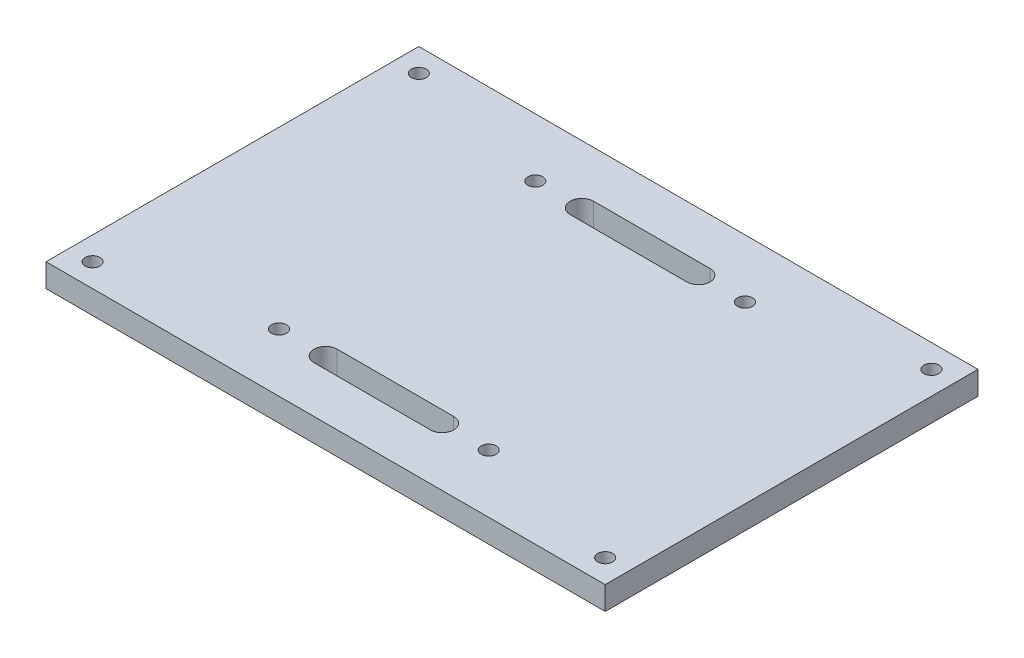
ISO-10303-21;
HEADER;
FILE_DESCRIPTION(('STEP AP214'),'2;1');
FILE_NAME('part.step','',(''),(''),'','','');
FILE_SCHEMA(('AUTOMOTIVE_DESIGN { 1 0 10303 214 1 1 1 1 }'));
ENDSEC;
DATA;
#1=APPLICATION_CONTEXT('core data for automotive mechanical design processes');
#2=APPLICATION_PROTOCOL_DEFINITION('international standard','automotive_design',2000,#1);
#3=PRODUCT_CONTEXT('',#1,'mechanical');
#4=PRODUCT('Part','Part','',(#3));
#5=PRODUCT_RELATED_PRODUCT_CATEGORY('part','',(#4));
#6=PRODUCT_DEFINITION_FORMATION('','',#4);
#7=PRODUCT_DEFINITION_CONTEXT('part definition',#1,'design');
#8=PRODUCT_DEFINITION('design','',#6,#7);
#9=PRODUCT_DEFINITION_SHAPE('','',#8);
#10=(LENGTH_UNIT() NAMED_UNIT(*) SI_UNIT(.MILLI.,.METRE.));
#11=(NAMED_UNIT(*) PLANE_ANGLE_UNIT() SI_UNIT($,.RADIAN.));
#12=(NAMED_UNIT(*) SI_UNIT($,.STERADIAN.) SOLID_ANGLE_UNIT());
#13=UNCERTAINTY_MEASURE_WITH_UNIT(LENGTH_MEASURE(1.E-05),#10,'distance_accuracy_value','');
#14=(GEOMETRIC_REPRESENTATION_CONTEXT(3) GLOBAL_UNCERTAINTY_ASSIGNED_CONTEXT((#13)) GLOBAL_UNIT_ASSIGNED_CONTEXT((#10,
#11,#12)) REPRESENTATION_CONTEXT('',''));
#15=CARTESIAN_POINT('',(0.,0.,0.));
#16=DIRECTION('',(0.,0.,1.));
#17=DIRECTION('',(1.,0.,0.));
#18=AXIS2_PLACEMENT_3D('',#15,#16,#17);
#19=CARTESIAN_POINT('',(0.,5.,0.));
#20=DIRECTION('',(1.,0.,0.));
#21=DIRECTION('',(0.,0.,-1.));
#22=AXIS2_PLACEMENT_3D('',#19,#20,#21);
#23=PLANE('',#22);
#24=DIRECTION('',(0.,0.,1.));
#25=VECTOR('',#24,1.);
#26=CARTESIAN_POINT('',(0.,0.,0.));
#27=LINE('',#26,#25);
#28=CARTESIAN_POINT('',(0.,0.,-80.));
#29=VERTEX_POINT('',#28);
#30=CARTESIAN_POINT('',(0.,0.,0.));
#31=VERTEX_POINT('',#30);
#32=EDGE_CURVE('E234',#29,#31,#27,.T.);
#33=ORIENTED_EDGE('',*,*,#32,.T.);
#34=DIRECTION('',(0.,-1.,0.));
#35=VECTOR('',#34,1.);
#36=CARTESIAN_POINT('',(0.,5.,0.));
#37=LINE('',#36,#35);
#38=CARTESIAN_POINT('',(0.,5.,0.));
#39=VERTEX_POINT('',#38);
#40=EDGE_CURVE('E11',#39,#31,#37,.T.);
#41=ORIENTED_EDGE('',*,*,#40,.F.);
#42=DIRECTION('',(0.,0.,1.));
#43=VECTOR('',#42,1.);
#44=CARTESIAN_POINT('',(0.,5.,0.));
#45=LINE('',#44,#43);
#46=CARTESIAN_POINT('',(0.,5.,-80.));
#47=VERTEX_POINT('',#46);
#48=EDGE_CURVE('E237',#47,#39,#45,.T.);
#49=ORIENTED_EDGE('',*,*,#48,.F.);
#50=DIRECTION('',(0.,-1.,0.));
#51=VECTOR('',#50,1.);
#52=CARTESIAN_POINT('',(0.,5.,-80.));
#53=LINE('',#52,#51);
#54=EDGE_CURVE('E247',#47,#29,#53,.T.);
#55=ORIENTED_EDGE('',*,*,#54,.T.);
#56=EDGE_LOOP('',(#33,#41,#49,#55));
#57=FACE_BOUND('',#56,.T.);
#58=ADVANCED_FACE('F33',(#57),#23,.F.);
#59=CARTESIAN_POINT('',(0.,5.,0.));
#60=DIRECTION('',(0.,0.,-1.));
#61=DIRECTION('',(-1.,0.,0.));
#62=AXIS2_PLACEMENT_3D('',#59,#60,#61);
#63=PLANE('',#62);
#64=DIRECTION('',(1.,0.,0.));
#65=VECTOR('',#64,1.);
#66=CARTESIAN_POINT('',(0.,0.,0.));
#67=LINE('',#66,#65);
#68=CARTESIAN_POINT('',(120.,0.,0.));
#69=VERTEX_POINT('',#68);
#70=EDGE_CURVE('E250',#31,#69,#67,.T.);
#71=ORIENTED_EDGE('',*,*,#70,.T.);
#72=DIRECTION('',(0.,-1.,0.));
#73=VECTOR('',#72,1.);
#74=CARTESIAN_POINT('',(120.,5.,0.));
#75=LINE('',#74,#73);
#76=CARTESIAN_POINT('',(120.,5.,0.));
#77=VERTEX_POINT('',#76);
#78=EDGE_CURVE('E40',#77,#69,#75,.T.);
#79=ORIENTED_EDGE('',*,*,#78,.F.);
#80=DIRECTION('',(1.,0.,0.));
#81=VECTOR('',#80,1.);
#82=CARTESIAN_POINT('',(0.,5.,0.));
#83=LINE('',#82,#81);
#84=EDGE_CURVE('E240',#39,#77,#83,.T.);
#85=ORIENTED_EDGE('',*,*,#84,.F.);
#86=ORIENTED_EDGE('',*,*,#40,.T.);
#87=EDGE_LOOP('',(#71,#79,#85,#86));
#88=FACE_BOUND('',#87,.T.);
#89=ADVANCED_FACE('F279',(#88),#63,.F.);
#90=CARTESIAN_POINT('',(120.,5.,0.));
#91=DIRECTION('',(-1.,0.,0.));
#92=DIRECTION('',(0.,0.,1.));
#93=AXIS2_PLACEMENT_3D('',#90,#91,#92);
#94=PLANE('',#93);
#95=DIRECTION('',(0.,0.,-1.));
#96=VECTOR('',#95,1.);
#97=CARTESIAN_POINT('',(120.,0.,0.));
#98=LINE('',#97,#96);
#99=CARTESIAN_POINT('',(120.,0.,-80.));
#100=VERTEX_POINT('',#99);
#101=EDGE_CURVE('E252',#69,#100,#98,.T.);
#102=ORIENTED_EDGE('',*,*,#101,.T.);
#103=DIRECTION('',(0.,-1.,0.));
#104=VECTOR('',#103,1.);
#105=CARTESIAN_POINT('',(120.,5.,-80.));
#106=LINE('',#105,#104);
#107=CARTESIAN_POINT('',(120.,5.,-80.));
#108=VERTEX_POINT('',#107);
#109=EDGE_CURVE('E257',#108,#100,#106,.T.);
#110=ORIENTED_EDGE('',*,*,#109,.F.);
#111=DIRECTION('',(0.,0.,-1.));
#112=VECTOR('',#111,1.);
#113=CARTESIAN_POINT('',(120.,5.,0.));
#114=LINE('',#113,#112);
#115=EDGE_CURVE('E243',#77,#108,#114,.T.);
#116=ORIENTED_EDGE('',*,*,#115,.F.);
#117=ORIENTED_EDGE('',*,*,#78,.T.);
#118=EDGE_LOOP('',(#102,#110,#116,#117));
#119=FACE_BOUND('',#118,.T.);
#120=ADVANCED_FACE('F264',(#119),#94,.F.);
#121=CARTESIAN_POINT('',(0.,5.,-80.));
#122=DIRECTION('',(0.,0.,1.));
#123=DIRECTION('',(1.,0.,0.));
#124=AXIS2_PLACEMENT_3D('',#121,#122,#123);
#125=PLANE('',#124);
#126=DIRECTION('',(-1.,0.,0.));
#127=VECTOR('',#126,1.);
#128=CARTESIAN_POINT('',(0.,0.,-80.));
#129=LINE('',#128,#127);
#130=EDGE_CURVE('E241',#100,#29,#129,.T.);
#131=ORIENTED_EDGE('',*,*,#130,.T.);
#132=ORIENTED_EDGE('',*,*,#54,.F.);
#133=DIRECTION('',(-1.,0.,0.));
#134=VECTOR('',#133,1.);
#135=CARTESIAN_POINT('',(0.,5.,-80.));
#136=LINE('',#135,#134);
#137=EDGE_CURVE('E245',#108,#47,#136,.T.);
#138=ORIENTED_EDGE('',*,*,#137,.F.);
#139=ORIENTED_EDGE('',*,*,#109,.T.);
#140=EDGE_LOOP('',(#131,#132,#138,#139));
#141=FACE_BOUND('',#140,.T.);
#142=ADVANCED_FACE('F272',(#141),#125,.F.);
#143=CARTESIAN_POINT('',(0.,5.,0.));
#144=DIRECTION('',(0.,-1.,0.));
#145=DIRECTION('',(0.,0.,-1.));
#146=AXIS2_PLACEMENT_3D('',#143,#144,#145);
#147=PLANE('',#146);
#148=CARTESIAN_POINT('',(115.,5.,-5.00000000000003));
#149=DIRECTION('',(0.,1.,0.));
#150=DIRECTION('',(0.,0.,1.));
#151=AXIS2_PLACEMENT_3D('',#148,#149,#150);
#152=CIRCLE('',#151,1.60000000000001);
#153=CARTESIAN_POINT('',(115.,5.,-3.40000000000003));
#154=VERTEX_POINT('',#153);
#155=EDGE_CURVE('E179',#154,#154,#152,.T.);
#156=ORIENTED_EDGE('',*,*,#155,.F.);
#157=EDGE_LOOP('',(#156));
#158=FACE_BOUND('',#157,.T.);
#159=CARTESIAN_POINT('',(115.,5.,-75.));
#160=DIRECTION('',(0.,1.,0.));
#161=DIRECTION('',(0.,0.,-1.));
#162=AXIS2_PLACEMENT_3D('',#159,#160,#161);
#163=CIRCLE('',#162,1.60000000000001);
#164=CARTESIAN_POINT('',(115.,5.,-76.6));
#165=VERTEX_POINT('',#164);
#166=EDGE_CURVE('E173',#165,#165,#163,.T.);
#167=ORIENTED_EDGE('',*,*,#166,.F.);
#168=EDGE_LOOP('',(#167));
#169=FACE_BOUND('',#168,.T.);
#170=CARTESIAN_POINT('',(5.,5.,-75.));
#171=DIRECTION('',(0.,1.,0.));
#172=DIRECTION('',(0.,0.,1.));
#173=AXIS2_PLACEMENT_3D('',#170,#171,#172);
#174=CIRCLE('',#173,1.6);
#175=CARTESIAN_POINT('',(5.,5.,-73.4));
#176=VERTEX_POINT('',#175);
#177=EDGE_CURVE('E167',#176,#176,#174,.T.);
#178=ORIENTED_EDGE('',*,*,#177,.F.);
#179=EDGE_LOOP('',(#178));
#180=FACE_BOUND('',#179,.T.);
#181=DIRECTION('',(1.,0.,0.));
#182=VECTOR('',#181,1.);
#183=CARTESIAN_POINT('',(47.5,5.,-9.99999999999999));
#184=LINE('',#183,#182);
#185=CARTESIAN_POINT('',(47.5,5.,-9.99999999999999));
#186=VERTEX_POINT('',#185);
#187=CARTESIAN_POINT('',(72.5,5.,-10.));
#188=VERTEX_POINT('',#187);
#189=EDGE_CURVE('E154',#186,#188,#184,.T.);
#190=ORIENTED_EDGE('',*,*,#189,.F.);
#191=CARTESIAN_POINT('',(47.5,5.,-12.5));
#192=DIRECTION('',(0.,1.,0.));
#193=DIRECTION('',(0.,0.,-1.));
#194=AXIS2_PLACEMENT_3D('',#191,#192,#193);
#195=CIRCLE('',#194,2.5);
#196=CARTESIAN_POINT('',(47.5,5.,-15.));
#197=VERTEX_POINT('',#196);
#198=EDGE_CURVE('E47',#197,#186,#195,.T.);
#199=ORIENTED_EDGE('',*,*,#198,.F.);
#200=DIRECTION('',(-1.,0.,0.));
#201=VECTOR('',#200,1.);
#202=CARTESIAN_POINT('',(47.5,5.,-15.));
#203=LINE('',#202,#201);
#204=CARTESIAN_POINT('',(72.5,5.,-15.));
#205=VERTEX_POINT('',#204);
#206=EDGE_CURVE('E142',#205,#197,#203,.T.);
#207=ORIENTED_EDGE('',*,*,#206,.F.);
#208=CARTESIAN_POINT('',(72.5,5.,-12.5));
#209=DIRECTION('',(0.,1.,0.));
#210=DIRECTION('',(0.,0.,-1.));
#211=AXIS2_PLACEMENT_3D('',#208,#209,#210);
#212=CIRCLE('',#211,2.5);
#213=EDGE_CURVE('E145',#188,#205,#212,.T.);
#214=ORIENTED_EDGE('',*,*,#213,.F.);
#215=EDGE_LOOP('',(#190,#199,#207,#214));
#216=FACE_BOUND('',#215,.T.);
#217=CARTESIAN_POINT('',(37.5,5.,-12.5));
#218=DIRECTION('',(0.,1.,0.));
#219=DIRECTION('',(0.,0.,-1.));
#220=AXIS2_PLACEMENT_3D('',#217,#218,#219);
#221=CIRCLE('',#220,1.6);
#222=CARTESIAN_POINT('',(37.5,5.,-14.1));
#223=VERTEX_POINT('',#222);
#224=EDGE_CURVE('E161',#223,#223,#221,.T.);
#225=ORIENTED_EDGE('',*,*,#224,.F.);
#226=EDGE_LOOP('',(#225));
#227=FACE_BOUND('',#226,.T.);
#228=CARTESIAN_POINT('',(82.5,5.,-12.5));
#229=DIRECTION('',(0.,1.,0.));
#230=DIRECTION('',(0.,0.,1.));
#231=AXIS2_PLACEMENT_3D('',#228,#229,#230);
#232=CIRCLE('',#231,1.6);
#233=CARTESIAN_POINT('',(82.5,5.,-10.9));
#234=VERTEX_POINT('',#233);
#235=EDGE_CURVE('E223',#234,#234,#232,.T.);
#236=ORIENTED_EDGE('',*,*,#235,.F.);
#237=EDGE_LOOP('',(#236));
#238=FACE_BOUND('',#237,.T.);
#239=CARTESIAN_POINT('',(82.5,5.,-67.5));
#240=DIRECTION('',(0.,1.,0.));
#241=DIRECTION('',(0.,0.,-1.));
#242=AXIS2_PLACEMENT_3D('',#239,#240,#241);
#243=CIRCLE('',#242,1.60000000000001);
#244=CARTESIAN_POINT('',(82.5,5.,-69.1));
#245=VERTEX_POINT('',#244);
#246=EDGE_CURVE('E217',#245,#245,#243,.T.);
#247=ORIENTED_EDGE('',*,*,#246,.F.);
#248=EDGE_LOOP('',(#247));
#249=FACE_BOUND('',#248,.T.);
#250=DIRECTION('',(1.,0.,0.));
#251=VECTOR('',#250,1.);
#252=CARTESIAN_POINT('',(47.5,5.,-65.));
#253=LINE('',#252,#251);
#254=CARTESIAN_POINT('',(47.5,5.,-65.));
#255=VERTEX_POINT('',#254);
#256=CARTESIAN_POINT('',(72.4999999999999,5.,-65.));
#257=VERTEX_POINT('',#256);
#258=EDGE_CURVE('E198',#255,#257,#253,.T.);
#259=ORIENTED_EDGE('',*,*,#258,.F.);
#260=CARTESIAN_POINT('',(47.5,5.,-67.5));
#261=DIRECTION('',(0.,1.,0.));
#262=DIRECTION('',(0.,0.,1.));
#263=AXIS2_PLACEMENT_3D('',#260,#261,#262);
#264=CIRCLE('',#263,2.5);
#265=CARTESIAN_POINT('',(47.5,5.,-70.));
#266=VERTEX_POINT('',#265);
#267=EDGE_CURVE('E55',#266,#255,#264,.T.);
#268=ORIENTED_EDGE('',*,*,#267,.F.);
#269=DIRECTION('',(-1.,0.,0.));
#270=VECTOR('',#269,1.);
#271=CARTESIAN_POINT('',(47.5,5.,-70.));
#272=LINE('',#271,#270);
#273=CARTESIAN_POINT('',(72.5,5.,-70.));
#274=VERTEX_POINT('',#273);
#275=EDGE_CURVE('E187',#274,#266,#272,.T.);
#276=ORIENTED_EDGE('',*,*,#275,.F.);
#277=CARTESIAN_POINT('',(72.5,5.,-67.5));
#278=DIRECTION('',(0.,1.,0.));
#279=DIRECTION('',(0.,0.,1.));
#280=AXIS2_PLACEMENT_3D('',#277,#278,#279);
#281=CIRCLE('',#280,2.5);
#282=EDGE_CURVE('E202',#257,#274,#281,.T.);
#283=ORIENTED_EDGE('',*,*,#282,.F.);
#284=EDGE_LOOP('',(#259,#268,#276,#283));
#285=FACE_BOUND('',#284,.T.);
#286=CARTESIAN_POINT('',(5.00000000000001,5.,-5.));
#287=DIRECTION('',(0.,1.,0.));
#288=DIRECTION('',(0.,0.,-1.));
#289=AXIS2_PLACEMENT_3D('',#286,#287,#288);
#290=CIRCLE('',#289,1.6);
#291=CARTESIAN_POINT('',(5.00000000000001,5.,-6.60000000000001));
#292=VERTEX_POINT('',#291);
#293=EDGE_CURVE('E148',#292,#292,#290,.T.);
#294=ORIENTED_EDGE('',*,*,#293,.F.);
#295=EDGE_LOOP('',(#294));
#296=FACE_BOUND('',#295,.T.);
#297=CARTESIAN_POINT('',(37.5,5.,-67.5));
#298=DIRECTION('',(0.,1.,0.));
#299=DIRECTION('',(0.,0.,1.));
#300=AXIS2_PLACEMENT_3D('',#297,#298,#299);
#301=CIRCLE('',#300,1.6);
#302=CARTESIAN_POINT('',(37.5,5.,-65.9));
#303=VERTEX_POINT('',#302);
#304=EDGE_CURVE('E209',#303,#303,#301,.T.);
#305=ORIENTED_EDGE('',*,*,#304,.F.);
#306=EDGE_LOOP('',(#305));
#307=FACE_BOUND('',#306,.T.);
#308=ORIENTED_EDGE('',*,*,#48,.T.);
#309=ORIENTED_EDGE('',*,*,#84,.T.);
#310=ORIENTED_EDGE('',*,*,#115,.T.);
#311=ORIENTED_EDGE('',*,*,#137,.T.);
#312=EDGE_LOOP('',(#308,#309,#310,#311));
#313=FACE_BOUND('',#312,.T.);
#314=ADVANCED_FACE('F278',(#158,#169,#180,#216,#227,#238,#249,#285,#296,#307,#313),#147,.F.);
#315=CARTESIAN_POINT('',(0.,0.,0.));
#316=DIRECTION('',(0.,-1.,0.));
#317=DIRECTION('',(0.,0.,-1.));
#318=AXIS2_PLACEMENT_3D('',#315,#316,#317);
#319=PLANE('',#318);
#320=CARTESIAN_POINT('',(115.,0.,-5.00000000000003));
#321=DIRECTION('',(0.,1.,0.));
#322=DIRECTION('',(0.,0.,1.));
#323=AXIS2_PLACEMENT_3D('',#320,#321,#322);
#324=CIRCLE('',#323,1.60000000000001);
#325=CARTESIAN_POINT('',(115.,0.,-3.40000000000003));
#326=VERTEX_POINT('',#325);
#327=EDGE_CURVE('E176',#326,#326,#324,.T.);
#328=ORIENTED_EDGE('',*,*,#327,.T.);
#329=EDGE_LOOP('',(#328));
#330=FACE_BOUND('',#329,.T.);
#331=CARTESIAN_POINT('',(115.,0.,-75.));
#332=DIRECTION('',(0.,1.,0.));
#333=DIRECTION('',(0.,0.,-1.));
#334=AXIS2_PLACEMENT_3D('',#331,#332,#333);
#335=CIRCLE('',#334,1.60000000000001);
#336=CARTESIAN_POINT('',(115.,0.,-76.6));
#337=VERTEX_POINT('',#336);
#338=EDGE_CURVE('E170',#337,#337,#335,.T.);
#339=ORIENTED_EDGE('',*,*,#338,.T.);
#340=EDGE_LOOP('',(#339));
#341=FACE_BOUND('',#340,.T.);
#342=CARTESIAN_POINT('',(5.,0.,-75.));
#343=DIRECTION('',(0.,1.,0.));
#344=DIRECTION('',(0.,0.,1.));
#345=AXIS2_PLACEMENT_3D('',#342,#343,#344);
#346=CIRCLE('',#345,1.6);
#347=CARTESIAN_POINT('',(5.,0.,-73.4));
#348=VERTEX_POINT('',#347);
#349=EDGE_CURVE('E155',#348,#348,#346,.T.);
#350=ORIENTED_EDGE('',*,*,#349,.T.);
#351=EDGE_LOOP('',(#350));
#352=FACE_BOUND('',#351,.T.);
#353=CARTESIAN_POINT('',(47.5,0.,-12.5));
#354=DIRECTION('',(0.,1.,0.));
#355=DIRECTION('',(0.,0.,-1.));
#356=AXIS2_PLACEMENT_3D('',#353,#354,#355);
#357=CIRCLE('',#356,2.5);
#358=CARTESIAN_POINT('',(47.5,0.,-15.));
#359=VERTEX_POINT('',#358);
#360=CARTESIAN_POINT('',(47.5,0.,-9.99999999999999));
#361=VERTEX_POINT('',#360);
#362=EDGE_CURVE('E123',#359,#361,#357,.T.);
#363=ORIENTED_EDGE('',*,*,#362,.T.);
#364=DIRECTION('',(1.,0.,0.));
#365=VECTOR('',#364,1.);
#366=CARTESIAN_POINT('',(47.5,0.,-9.99999999999999));
#367=LINE('',#366,#365);
#368=CARTESIAN_POINT('',(72.5,0.,-10.));
#369=VERTEX_POINT('',#368);
#370=EDGE_CURVE('E133',#361,#369,#367,.T.);
#371=ORIENTED_EDGE('',*,*,#370,.T.);
#372=CARTESIAN_POINT('',(72.5,0.,-12.5));
#373=DIRECTION('',(0.,1.,0.));
#374=DIRECTION('',(0.,0.,-1.));
#375=AXIS2_PLACEMENT_3D('',#372,#373,#374);
#376=CIRCLE('',#375,2.5);
#377=CARTESIAN_POINT('',(72.5,0.,-15.));
#378=VERTEX_POINT('',#377);
#379=EDGE_CURVE('E137',#369,#378,#376,.T.);
#380=ORIENTED_EDGE('',*,*,#379,.T.);
#381=DIRECTION('',(-1.,0.,0.));
#382=VECTOR('',#381,1.);
#383=CARTESIAN_POINT('',(47.5,0.,-15.));
#384=LINE('',#383,#382);
#385=EDGE_CURVE('E129',#378,#359,#384,.T.);
#386=ORIENTED_EDGE('',*,*,#385,.T.);
#387=EDGE_LOOP('',(#363,#371,#380,#386));
#388=FACE_BOUND('',#387,.T.);
#389=CARTESIAN_POINT('',(37.5,0.,-12.5));
#390=DIRECTION('',(0.,1.,0.));
#391=DIRECTION('',(0.,0.,-1.));
#392=AXIS2_PLACEMENT_3D('',#389,#390,#391);
#393=CIRCLE('',#392,1.6);
#394=CARTESIAN_POINT('',(37.5,0.,-14.1));
#395=VERTEX_POINT('',#394);
#396=EDGE_CURVE('E226',#395,#395,#393,.T.);
#397=ORIENTED_EDGE('',*,*,#396,.T.);
#398=EDGE_LOOP('',(#397));
#399=FACE_BOUND('',#398,.T.);
#400=CARTESIAN_POINT('',(82.5,0.,-12.5));
#401=DIRECTION('',(0.,1.,0.));
#402=DIRECTION('',(0.,0.,1.));
#403=AXIS2_PLACEMENT_3D('',#400,#401,#402);
#404=CIRCLE('',#403,1.6);
#405=CARTESIAN_POINT('',(82.5,0.,-10.9));
#406=VERTEX_POINT('',#405);
#407=EDGE_CURVE('E220',#406,#406,#404,.T.);
#408=ORIENTED_EDGE('',*,*,#407,.T.);
#409=EDGE_LOOP('',(#408));
#410=FACE_BOUND('',#409,.T.);
#411=CARTESIAN_POINT('',(82.5,0.,-67.5));
#412=DIRECTION('',(0.,1.,0.));
#413=DIRECTION('',(0.,0.,-1.));
#414=AXIS2_PLACEMENT_3D('',#411,#412,#413);
#415=CIRCLE('',#414,1.60000000000001);
#416=CARTESIAN_POINT('',(82.5,0.,-69.1));
#417=VERTEX_POINT('',#416);
#418=EDGE_CURVE('E199',#417,#417,#415,.T.);
#419=ORIENTED_EDGE('',*,*,#418,.T.);
#420=EDGE_LOOP('',(#419));
#421=FACE_BOUND('',#420,.T.);
#422=CARTESIAN_POINT('',(47.5,0.,-67.5));
#423=DIRECTION('',(0.,1.,0.));
#424=DIRECTION('',(0.,0.,1.));
#425=AXIS2_PLACEMENT_3D('',#422,#423,#424);
#426=CIRCLE('',#425,2.5);
#427=CARTESIAN_POINT('',(47.5,0.,-70.));
#428=VERTEX_POINT('',#427);
#429=CARTESIAN_POINT('',(47.5,0.,-65.));
#430=VERTEX_POINT('',#429);
#431=EDGE_CURVE('E183',#428,#430,#426,.T.);
#432=ORIENTED_EDGE('',*,*,#431,.T.);
#433=DIRECTION('',(1.,0.,0.));
#434=VECTOR('',#433,1.);
#435=CARTESIAN_POINT('',(47.5,0.,-65.));
#436=LINE('',#435,#434);
#437=CARTESIAN_POINT('',(72.4999999999999,0.,-65.));
#438=VERTEX_POINT('',#437);
#439=EDGE_CURVE('E186',#430,#438,#436,.T.);
#440=ORIENTED_EDGE('',*,*,#439,.T.);
#441=CARTESIAN_POINT('',(72.5,0.,-67.5));
#442=DIRECTION('',(0.,1.,0.));
#443=DIRECTION('',(0.,0.,1.));
#444=AXIS2_PLACEMENT_3D('',#441,#442,#443);
#445=CIRCLE('',#444,2.5);
#446=CARTESIAN_POINT('',(72.5,0.,-70.));
#447=VERTEX_POINT('',#446);
#448=EDGE_CURVE('E190',#438,#447,#445,.T.);
#449=ORIENTED_EDGE('',*,*,#448,.T.);
#450=DIRECTION('',(-1.,0.,0.));
#451=VECTOR('',#450,1.);
#452=CARTESIAN_POINT('',(47.5,0.,-70.));
#453=LINE('',#452,#451);
#454=EDGE_CURVE('E193',#447,#428,#453,.T.);
#455=ORIENTED_EDGE('',*,*,#454,.T.);
#456=EDGE_LOOP('',(#432,#440,#449,#455));
#457=FACE_BOUND('',#456,.T.);
#458=CARTESIAN_POINT('',(5.00000000000001,0.,-5.));
#459=DIRECTION('',(0.,1.,0.));
#460=DIRECTION('',(0.,0.,-1.));
#461=AXIS2_PLACEMENT_3D('',#458,#459,#460);
#462=CIRCLE('',#461,1.6);
#463=CARTESIAN_POINT('',(5.00000000000001,0.,-6.60000000000001));
#464=VERTEX_POINT('',#463);
#465=EDGE_CURVE('E182',#464,#464,#462,.T.);
#466=ORIENTED_EDGE('',*,*,#465,.T.);
#467=EDGE_LOOP('',(#466));
#468=FACE_BOUND('',#467,.T.);
#469=CARTESIAN_POINT('',(37.5,0.,-67.5));
#470=DIRECTION('',(0.,1.,0.));
#471=DIRECTION('',(0.,0.,1.));
#472=AXIS2_PLACEMENT_3D('',#469,#470,#471);
#473=CIRCLE('',#472,1.6);
#474=CARTESIAN_POINT('',(37.5,0.,-65.9));
#475=VERTEX_POINT('',#474);
#476=EDGE_CURVE('E231',#475,#475,#473,.T.);
#477=ORIENTED_EDGE('',*,*,#476,.T.);
#478=EDGE_LOOP('',(#477));
#479=FACE_BOUND('',#478,.T.);
#480=ORIENTED_EDGE('',*,*,#32,.F.);
#481=ORIENTED_EDGE('',*,*,#130,.F.);
#482=ORIENTED_EDGE('',*,*,#101,.F.);
#483=ORIENTED_EDGE('',*,*,#70,.F.);
#484=EDGE_LOOP('',(#480,#481,#482,#483));
#485=FACE_BOUND('',#484,.T.);
#486=ADVANCED_FACE('F139',(#330,#341,#352,#388,#399,#410,#421,#457,#468,#479,#485),#319,.T.);
#487=CARTESIAN_POINT('',(37.5,0.,-67.5));
#488=DIRECTION('',(0.,1.,0.));
#489=DIRECTION('',(0.,0.,1.));
#490=AXIS2_PLACEMENT_3D('',#487,#488,#489);
#491=CYLINDRICAL_SURFACE('',#490,1.6);
#492=ORIENTED_EDGE('',*,*,#476,.F.);
#493=EDGE_LOOP('',(#492));
#494=FACE_BOUND('',#493,.T.);
#495=ORIENTED_EDGE('',*,*,#304,.T.);
#496=EDGE_LOOP('',(#495));
#497=FACE_BOUND('',#496,.T.);
#498=ADVANCED_FACE('F291',(#494,#497),#491,.F.);
#499=CARTESIAN_POINT('',(5.00000000000001,0.,-5.));
#500=DIRECTION('',(0.,1.,0.));
#501=DIRECTION('',(0.,0.,1.));
#502=AXIS2_PLACEMENT_3D('',#499,#500,#501);
#503=CYLINDRICAL_SURFACE('',#502,1.6);
#504=ORIENTED_EDGE('',*,*,#465,.F.);
#505=EDGE_LOOP('',(#504));
#506=FACE_BOUND('',#505,.T.);
#507=ORIENTED_EDGE('',*,*,#293,.T.);
#508=EDGE_LOOP('',(#507));
#509=FACE_BOUND('',#508,.T.);
#510=ADVANCED_FACE('F298',(#506,#509),#503,.F.);
#511=CARTESIAN_POINT('',(47.5,0.,-67.5));
#512=DIRECTION('',(0.,1.,0.));
#513=DIRECTION('',(0.,0.,1.));
#514=AXIS2_PLACEMENT_3D('',#511,#512,#513);
#515=CYLINDRICAL_SURFACE('',#514,2.5);
#516=ORIENTED_EDGE('',*,*,#267,.T.);
#517=DIRECTION('',(0.,1.,0.));
#518=VECTOR('',#517,1.);
#519=CARTESIAN_POINT('',(47.5,0.,-65.));
#520=LINE('',#519,#518);
#521=EDGE_CURVE('E196',#430,#255,#520,.T.);
#522=ORIENTED_EDGE('',*,*,#521,.F.);
#523=ORIENTED_EDGE('',*,*,#431,.F.);
#524=DIRECTION('',(0.,1.,0.));
#525=VECTOR('',#524,1.);
#526=CARTESIAN_POINT('',(47.5,0.,-70.));
#527=LINE('',#526,#525);
#528=EDGE_CURVE('E207',#428,#266,#527,.T.);
#529=ORIENTED_EDGE('',*,*,#528,.T.);
#530=EDGE_LOOP('',(#516,#522,#523,#529));
#531=FACE_BOUND('',#530,.T.);
#532=ADVANCED_FACE('F313',(#531),#515,.F.);
#533=CARTESIAN_POINT('',(47.5,0.,-70.));
#534=DIRECTION('',(0.,0.,-1.));
#535=DIRECTION('',(-1.,0.,0.));
#536=AXIS2_PLACEMENT_3D('',#533,#534,#535);
#537=PLANE('',#536);
#538=ORIENTED_EDGE('',*,*,#275,.T.);
#539=ORIENTED_EDGE('',*,*,#528,.F.);
#540=ORIENTED_EDGE('',*,*,#454,.F.);
#541=DIRECTION('',(0.,1.,0.));
#542=VECTOR('',#541,1.);
#543=CARTESIAN_POINT('',(72.5,0.,-70.));
#544=LINE('',#543,#542);
#545=EDGE_CURVE('E210',#447,#274,#544,.T.);
#546=ORIENTED_EDGE('',*,*,#545,.T.);
#547=EDGE_LOOP('',(#538,#539,#540,#546));
#548=FACE_BOUND('',#547,.T.);
#549=ADVANCED_FACE('F316',(#548),#537,.F.);
#550=CARTESIAN_POINT('',(72.5,0.,-67.5));
#551=DIRECTION('',(0.,1.,0.));
#552=DIRECTION('',(0.,0.,1.));
#553=AXIS2_PLACEMENT_3D('',#550,#551,#552);
#554=CYLINDRICAL_SURFACE('',#553,2.5);
#555=ORIENTED_EDGE('',*,*,#282,.T.);
#556=ORIENTED_EDGE('',*,*,#545,.F.);
#557=ORIENTED_EDGE('',*,*,#448,.F.);
#558=DIRECTION('',(0.,1.,0.));
#559=VECTOR('',#558,1.);
#560=CARTESIAN_POINT('',(72.4999999999999,0.,-65.));
#561=LINE('',#560,#559);
#562=EDGE_CURVE('E212',#438,#257,#561,.T.);
#563=ORIENTED_EDGE('',*,*,#562,.T.);
#564=EDGE_LOOP('',(#555,#556,#557,#563));
#565=FACE_BOUND('',#564,.T.);
#566=ADVANCED_FACE('F319',(#565),#554,.F.);
#567=CARTESIAN_POINT('',(47.5,0.,-65.));
#568=DIRECTION('',(0.,0.,1.));
#569=DIRECTION('',(1.,0.,0.));
#570=AXIS2_PLACEMENT_3D('',#567,#568,#569);
#571=PLANE('',#570);
#572=ORIENTED_EDGE('',*,*,#258,.T.);
#573=ORIENTED_EDGE('',*,*,#562,.F.);
#574=ORIENTED_EDGE('',*,*,#439,.F.);
#575=ORIENTED_EDGE('',*,*,#521,.T.);
#576=EDGE_LOOP('',(#572,#573,#574,#575));
#577=FACE_BOUND('',#576,.T.);
#578=ADVANCED_FACE('F311',(#577),#571,.F.);
#579=CARTESIAN_POINT('',(82.5,0.,-67.5));
#580=DIRECTION('',(0.,1.,0.));
#581=DIRECTION('',(0.,0.,1.));
#582=AXIS2_PLACEMENT_3D('',#579,#580,#581);
#583=CYLINDRICAL_SURFACE('',#582,1.60000000000001);
#584=ORIENTED_EDGE('',*,*,#418,.F.);
#585=EDGE_LOOP('',(#584));
#586=FACE_BOUND('',#585,.T.);
#587=ORIENTED_EDGE('',*,*,#246,.T.);
#588=EDGE_LOOP('',(#587));
#589=FACE_BOUND('',#588,.T.);
#590=ADVANCED_FACE('F307',(#586,#589),#583,.F.);
#591=CARTESIAN_POINT('',(82.5,0.,-12.5));
#592=DIRECTION('',(0.,1.,0.));
#593=DIRECTION('',(0.,0.,1.));
#594=AXIS2_PLACEMENT_3D('',#591,#592,#593);
#595=CYLINDRICAL_SURFACE('',#594,1.6);
#596=ORIENTED_EDGE('',*,*,#407,.F.);
#597=EDGE_LOOP('',(#596));
#598=FACE_BOUND('',#597,.T.);
#599=ORIENTED_EDGE('',*,*,#235,.T.);
#600=EDGE_LOOP('',(#599));
#601=FACE_BOUND('',#600,.T.);
#602=ADVANCED_FACE('F303',(#598,#601),#595,.F.);
#603=CARTESIAN_POINT('',(37.5,0.,-12.5));
#604=DIRECTION('',(0.,1.,0.));
#605=DIRECTION('',(0.,0.,1.));
#606=AXIS2_PLACEMENT_3D('',#603,#604,#605);
#607=CYLINDRICAL_SURFACE('',#606,1.6);
#608=ORIENTED_EDGE('',*,*,#396,.F.);
#609=EDGE_LOOP('',(#608));
#610=FACE_BOUND('',#609,.T.);
#611=ORIENTED_EDGE('',*,*,#224,.T.);
#612=EDGE_LOOP('',(#611));
#613=FACE_BOUND('',#612,.T.);
#614=ADVANCED_FACE('F300',(#610,#613),#607,.F.);
#615=CARTESIAN_POINT('',(47.5,0.,-12.5));
#616=DIRECTION('',(0.,1.,0.));
#617=DIRECTION('',(0.,0.,1.));
#618=AXIS2_PLACEMENT_3D('',#615,#616,#617);
#619=CYLINDRICAL_SURFACE('',#618,2.5);
#620=ORIENTED_EDGE('',*,*,#198,.T.);
#621=DIRECTION('',(0.,1.,0.));
#622=VECTOR('',#621,1.);
#623=CARTESIAN_POINT('',(47.5,0.,-9.99999999999999));
#624=LINE('',#623,#622);
#625=EDGE_CURVE('E119',#361,#186,#624,.T.);
#626=ORIENTED_EDGE('',*,*,#625,.F.);
#627=ORIENTED_EDGE('',*,*,#362,.F.);
#628=DIRECTION('',(0.,1.,0.));
#629=VECTOR('',#628,1.);
#630=CARTESIAN_POINT('',(47.5,0.,-15.));
#631=LINE('',#630,#629);
#632=EDGE_CURVE('E159',#359,#197,#631,.T.);
#633=ORIENTED_EDGE('',*,*,#632,.T.);
#634=EDGE_LOOP('',(#620,#626,#627,#633));
#635=FACE_BOUND('',#634,.T.);
#636=ADVANCED_FACE('F121',(#635),#619,.F.);
#637=CARTESIAN_POINT('',(47.5,0.,-15.));
#638=DIRECTION('',(0.,0.,-1.));
#639=DIRECTION('',(-1.,0.,0.));
#640=AXIS2_PLACEMENT_3D('',#637,#638,#639);
#641=PLANE('',#640);
#642=ORIENTED_EDGE('',*,*,#206,.T.);
#643=ORIENTED_EDGE('',*,*,#632,.F.);
#644=ORIENTED_EDGE('',*,*,#385,.F.);
#645=DIRECTION('',(0.,1.,0.));
#646=VECTOR('',#645,1.);
#647=CARTESIAN_POINT('',(72.5,0.,-15.));
#648=LINE('',#647,#646);
#649=EDGE_CURVE('E162',#378,#205,#648,.T.);
#650=ORIENTED_EDGE('',*,*,#649,.T.);
#651=EDGE_LOOP('',(#642,#643,#644,#650));
#652=FACE_BOUND('',#651,.T.);
#653=ADVANCED_FACE('F341',(#652),#641,.F.);
#654=CARTESIAN_POINT('',(72.5,0.,-12.5));
#655=DIRECTION('',(0.,1.,0.));
#656=DIRECTION('',(0.,0.,1.));
#657=AXIS2_PLACEMENT_3D('',#654,#655,#656);
#658=CYLINDRICAL_SURFACE('',#657,2.5);
#659=ORIENTED_EDGE('',*,*,#213,.T.);
#660=ORIENTED_EDGE('',*,*,#649,.F.);
#661=ORIENTED_EDGE('',*,*,#379,.F.);
#662=DIRECTION('',(0.,1.,0.));
#663=VECTOR('',#662,1.);
#664=CARTESIAN_POINT('',(72.5,0.,-10.));
#665=LINE('',#664,#663);
#666=EDGE_CURVE('E128',#369,#188,#665,.T.);
#667=ORIENTED_EDGE('',*,*,#666,.T.);
#668=EDGE_LOOP('',(#659,#660,#661,#667));
#669=FACE_BOUND('',#668,.T.);
#670=ADVANCED_FACE('F344',(#669),#658,.F.);
#671=CARTESIAN_POINT('',(47.5,0.,-9.99999999999999));
#672=DIRECTION('',(0.,0.,1.));
#673=DIRECTION('',(1.,0.,0.));
#674=AXIS2_PLACEMENT_3D('',#671,#672,#673);
#675=PLANE('',#674);
#676=ORIENTED_EDGE('',*,*,#189,.T.);
#677=ORIENTED_EDGE('',*,*,#666,.F.);
#678=ORIENTED_EDGE('',*,*,#370,.F.);
#679=ORIENTED_EDGE('',*,*,#625,.T.);
#680=EDGE_LOOP('',(#676,#677,#678,#679));
#681=FACE_BOUND('',#680,.T.);
#682=ADVANCED_FACE('F134',(#681),#675,.F.);
#683=CARTESIAN_POINT('',(5.,0.,-75.));
#684=DIRECTION('',(0.,1.,0.));
#685=DIRECTION('',(0.,0.,1.));
#686=AXIS2_PLACEMENT_3D('',#683,#684,#685);
#687=CYLINDRICAL_SURFACE('',#686,1.6);
#688=ORIENTED_EDGE('',*,*,#349,.F.);
#689=EDGE_LOOP('',(#688));
#690=FACE_BOUND('',#689,.T.);
#691=ORIENTED_EDGE('',*,*,#177,.T.);
#692=EDGE_LOOP('',(#691));
#693=FACE_BOUND('',#692,.T.);
#694=ADVANCED_FACE('F334',(#690,#693),#687,.F.);
#695=CARTESIAN_POINT('',(115.,0.,-75.));
#696=DIRECTION('',(0.,1.,0.));
#697=DIRECTION('',(0.,0.,1.));
#698=AXIS2_PLACEMENT_3D('',#695,#696,#697);
#699=CYLINDRICAL_SURFACE('',#698,1.60000000000001);
#700=ORIENTED_EDGE('',*,*,#338,.F.);
#701=EDGE_LOOP('',(#700));
#702=FACE_BOUND('',#701,.T.);
#703=ORIENTED_EDGE('',*,*,#166,.T.);
#704=EDGE_LOOP('',(#703));
#705=FACE_BOUND('',#704,.T.);
#706=ADVANCED_FACE('F330',(#702,#705),#699,.F.);
#707=CARTESIAN_POINT('',(115.,0.,-5.00000000000003));
#708=DIRECTION('',(0.,1.,0.));
#709=DIRECTION('',(0.,0.,1.));
#710=AXIS2_PLACEMENT_3D('',#707,#708,#709);
#711=CYLINDRICAL_SURFACE('',#710,1.60000000000001);
#712=ORIENTED_EDGE('',*,*,#327,.F.);
#713=EDGE_LOOP('',(#712));
#714=FACE_BOUND('',#713,.T.);
#715=ORIENTED_EDGE('',*,*,#155,.T.);
#716=EDGE_LOOP('',(#715));
#717=FACE_BOUND('',#716,.T.);
#718=ADVANCED_FACE('F327',(#714,#717),#711,.F.);
#719=CLOSED_SHELL('',(#58,#89,#120,#142,#314,#486,#498,#510,#532,#549,#566,#578,#590,#602,#614,
#636,#653,#670,#682,#694,#706,#718));
#720=MANIFOLD_SOLID_BREP('B2',#719);
#721=ADVANCED_BREP_SHAPE_REPRESENTATION('',(#18,#720),#14);
#722=SHAPE_DEFINITION_REPRESENTATION(#9,#721);
ENDSEC;
END-ISO-10303-21;
